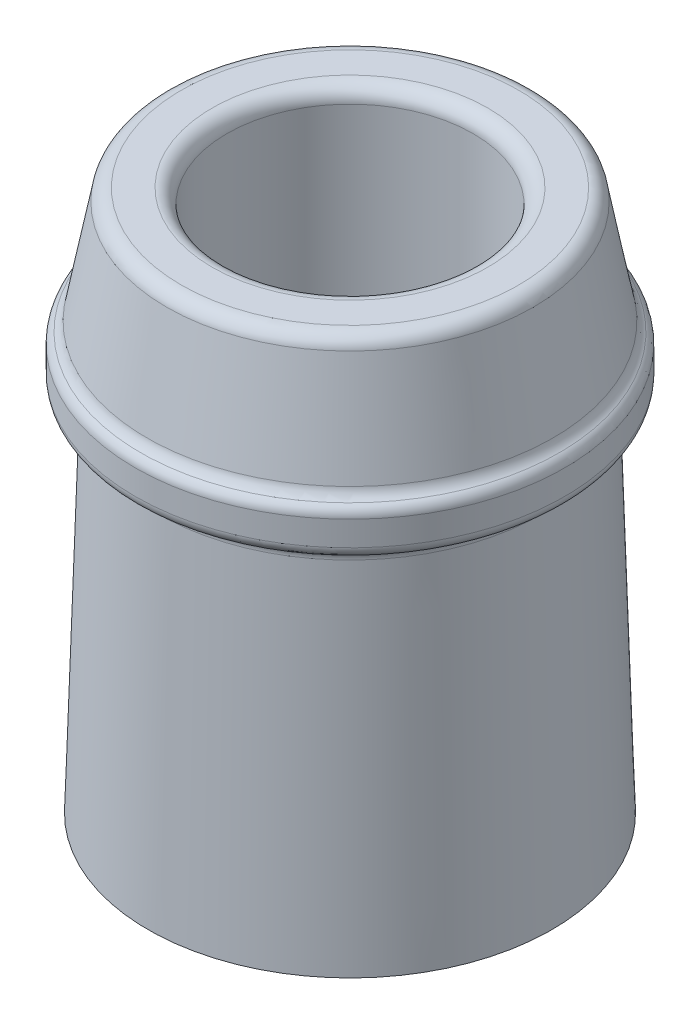
ISO-10303-21;
HEADER;
FILE_DESCRIPTION(('STEP AP214'),'2;1');
FILE_NAME('part.step','',(''),(''),'','','');
FILE_SCHEMA(('AUTOMOTIVE_DESIGN { 1 0 10303 214 1 1 1 1 }'));
ENDSEC;
DATA;
#1=APPLICATION_CONTEXT('core data for automotive mechanical design processes');
#2=APPLICATION_PROTOCOL_DEFINITION('international standard','automotive_design',2000,#1);
#3=PRODUCT_CONTEXT('',#1,'mechanical');
#4=PRODUCT('Part','Part','',(#3));
#5=PRODUCT_RELATED_PRODUCT_CATEGORY('part','',(#4));
#6=PRODUCT_DEFINITION_FORMATION('','',#4);
#7=PRODUCT_DEFINITION_CONTEXT('part definition',#1,'design');
#8=PRODUCT_DEFINITION('design','',#6,#7);
#9=PRODUCT_DEFINITION_SHAPE('','',#8);
#10=(LENGTH_UNIT() NAMED_UNIT(*) SI_UNIT(.MILLI.,.METRE.));
#11=(NAMED_UNIT(*) PLANE_ANGLE_UNIT() SI_UNIT($,.RADIAN.));
#12=(NAMED_UNIT(*) SI_UNIT($,.STERADIAN.) SOLID_ANGLE_UNIT());
#13=UNCERTAINTY_MEASURE_WITH_UNIT(LENGTH_MEASURE(1.E-05),#10,'distance_accuracy_value','');
#14=(GEOMETRIC_REPRESENTATION_CONTEXT(3) GLOBAL_UNCERTAINTY_ASSIGNED_CONTEXT((#13)) GLOBAL_UNIT_ASSIGNED_CONTEXT((#10,
#11,#12)) REPRESENTATION_CONTEXT('',''));
#15=CARTESIAN_POINT('',(0.,0.,0.));
#16=DIRECTION('',(0.,0.,1.));
#17=DIRECTION('',(1.,0.,0.));
#18=AXIS2_PLACEMENT_3D('',#15,#16,#17);
#19=CARTESIAN_POINT('',(7.35,22.,0.));
#20=DIRECTION('',(0.,1.,0.));
#21=DIRECTION('',(0.,0.,1.));
#22=AXIS2_PLACEMENT_3D('',#19,#20,#21);
#23=PLANE('',#22);
#24=CARTESIAN_POINT('',(0.,22.,0.));
#25=DIRECTION('',(0.,1.,0.));
#26=DIRECTION('',(0.,0.,1.));
#27=AXIS2_PLACEMENT_3D('',#24,#25,#26);
#28=CIRCLE('',#27,5.6);
#29=CARTESIAN_POINT('',(0.,22.,5.6));
#30=VERTEX_POINT('',#29);
#31=EDGE_CURVE('E58',#30,#30,#28,.F.);
#32=ORIENTED_EDGE('',*,*,#31,.T.);
#33=EDGE_LOOP('',(#32));
#34=FACE_BOUND('',#33,.T.);
#35=CARTESIAN_POINT('',(0.,22.,0.));
#36=DIRECTION('',(0.,1.,0.));
#37=DIRECTION('',(0.,0.,1.));
#38=AXIS2_PLACEMENT_3D('',#35,#36,#37);
#39=CIRCLE('',#38,6.85326601535529);
#40=CARTESIAN_POINT('',(0.,22.,6.85326601535529));
#41=VERTEX_POINT('',#40);
#42=EDGE_CURVE('E61',#41,#41,#39,.T.);
#43=ORIENTED_EDGE('',*,*,#42,.T.);
#44=EDGE_LOOP('',(#43));
#45=FACE_BOUND('',#44,.T.);
#46=ADVANCED_FACE('F32',(#34,#45),#23,.T.);
#47=CARTESIAN_POINT('',(0.,0.,0.));
#48=DIRECTION('',(0.,-1.,0.));
#49=DIRECTION('',(0.,0.,-1.));
#50=AXIS2_PLACEMENT_3D('',#47,#48,#49);
#51=CYLINDRICAL_SURFACE('',#50,5.);
#52=CARTESIAN_POINT('',(0.,21.4,0.));
#53=DIRECTION('',(0.,1.,0.));
#54=DIRECTION('',(0.,0.,1.));
#55=AXIS2_PLACEMENT_3D('',#52,#53,#54);
#56=CIRCLE('',#55,5.);
#57=CARTESIAN_POINT('',(0.,21.4,5.));
#58=VERTEX_POINT('',#57);
#59=EDGE_CURVE('E55',#58,#58,#56,.T.);
#60=ORIENTED_EDGE('',*,*,#59,.T.);
#61=EDGE_LOOP('',(#60));
#62=FACE_BOUND('',#61,.T.);
#63=CARTESIAN_POINT('',(0.,0.,0.));
#64=DIRECTION('',(0.,-1.,0.));
#65=DIRECTION('',(0.,0.,-1.));
#66=AXIS2_PLACEMENT_3D('',#63,#64,#65);
#67=CIRCLE('',#66,5.);
#68=CARTESIAN_POINT('',(0.,0.,-5.));
#69=VERTEX_POINT('',#68);
#70=EDGE_CURVE('E70',#69,#69,#67,.T.);
#71=ORIENTED_EDGE('',*,*,#70,.T.);
#72=EDGE_LOOP('',(#71));
#73=FACE_BOUND('',#72,.T.);
#74=ADVANCED_FACE('F92',(#62,#73),#51,.F.);
#75=CARTESIAN_POINT('',(8.2,0.,0.));
#76=DIRECTION('',(0.,-1.,0.));
#77=DIRECTION('',(0.,0.,-1.));
#78=AXIS2_PLACEMENT_3D('',#75,#76,#77);
#79=PLANE('',#78);
#80=CARTESIAN_POINT('',(0.,0.,0.));
#81=DIRECTION('',(0.,-1.,0.));
#82=DIRECTION('',(0.,0.,-1.));
#83=AXIS2_PLACEMENT_3D('',#80,#81,#82);
#84=CIRCLE('',#83,8.2);
#85=CARTESIAN_POINT('',(0.,0.,-8.2));
#86=VERTEX_POINT('',#85);
#87=EDGE_CURVE('E73',#86,#86,#84,.T.);
#88=ORIENTED_EDGE('',*,*,#87,.T.);
#89=EDGE_LOOP('',(#88));
#90=FACE_BOUND('',#89,.T.);
#91=ORIENTED_EDGE('',*,*,#70,.F.);
#92=EDGE_LOOP('',(#91));
#93=FACE_BOUND('',#92,.T.);
#94=ADVANCED_FACE('F77',(#90,#93),#79,.T.);
#95=CARTESIAN_POINT('',(0.,0.,0.));
#96=DIRECTION('',(0.,-1.,0.));
#97=DIRECTION('',(0.,0.,-1.));
#98=AXIS2_PLACEMENT_3D('',#95,#96,#97);
#99=CONICAL_SURFACE('',#98,8.2,0.0299910048568778);
#100=CARTESIAN_POINT('',(0.,14.39134138244,0.));
#101=DIRECTION('',(0.,-1.,0.));
#102=DIRECTION('',(0.,0.,-1.));
#103=AXIS2_PLACEMENT_3D('',#100,#101,#102);
#104=CIRCLE('',#103,7.7682597585268);
#105=CARTESIAN_POINT('',(0.,14.39134138244,-7.7682597585268));
#106=VERTEX_POINT('',#105);
#107=EDGE_CURVE('E43',#106,#106,#104,.T.);
#108=ORIENTED_EDGE('',*,*,#107,.T.);
#109=EDGE_LOOP('',(#108));
#110=FACE_BOUND('',#109,.T.);
#111=ORIENTED_EDGE('',*,*,#87,.F.);
#112=EDGE_LOOP('',(#111));
#113=FACE_BOUND('',#112,.T.);
#114=ADVANCED_FACE('F80',(#110,#113),#99,.T.);
#115=CARTESIAN_POINT('',(0.,0.,0.));
#116=DIRECTION('',(0.,-1.,0.));
#117=DIRECTION('',(0.,0.,-1.));
#118=AXIS2_PLACEMENT_3D('',#115,#116,#117);
#119=CYLINDRICAL_SURFACE('',#118,8.725);
#120=CARTESIAN_POINT('',(0.,15.5,0.));
#121=DIRECTION('',(0.,-1.,0.));
#122=DIRECTION('',(0.,0.,-1.));
#123=AXIS2_PLACEMENT_3D('',#120,#121,#122);
#124=CIRCLE('',#123,8.725);
#125=CARTESIAN_POINT('',(0.,15.5,-8.725));
#126=VERTEX_POINT('',#125);
#127=EDGE_CURVE('E64',#126,#126,#124,.F.);
#128=ORIENTED_EDGE('',*,*,#127,.T.);
#129=EDGE_LOOP('',(#128));
#130=FACE_BOUND('',#129,.T.);
#131=CARTESIAN_POINT('',(0.,16.5056570016679,0.));
#132=DIRECTION('',(0.,1.,0.));
#133=DIRECTION('',(0.,0.,1.));
#134=AXIS2_PLACEMENT_3D('',#131,#132,#133);
#135=CIRCLE('',#134,8.725);
#136=CARTESIAN_POINT('',(0.,16.5056570016679,8.725));
#137=VERTEX_POINT('',#136);
#138=EDGE_CURVE('E67',#137,#137,#135,.F.);
#139=ORIENTED_EDGE('',*,*,#138,.T.);
#140=EDGE_LOOP('',(#139));
#141=FACE_BOUND('',#140,.T.);
#142=ADVANCED_FACE('F82',(#130,#141),#119,.T.);
#143=CARTESIAN_POINT('',(0.,17.,0.));
#144=DIRECTION('',(0.,-1.,0.));
#145=DIRECTION('',(0.,0.,-1.));
#146=AXIS2_PLACEMENT_3D('',#143,#144,#145);
#147=CONICAL_SURFACE('',#146,8.3,0.187761946513593);
#148=CARTESIAN_POINT('',(0.,21.511996387494,0.));
#149=DIRECTION('',(0.,1.,0.));
#150=DIRECTION('',(0.,0.,1.));
#151=AXIS2_PLACEMENT_3D('',#148,#149,#150);
#152=CIRCLE('',#151,7.44272068637615);
#153=CARTESIAN_POINT('',(0.,21.511996387494,7.44272068637615));
#154=VERTEX_POINT('',#153);
#155=EDGE_CURVE('E47',#154,#154,#152,.F.);
#156=ORIENTED_EDGE('',*,*,#155,.T.);
#157=EDGE_LOOP('',(#156));
#158=FACE_BOUND('',#157,.T.);
#159=CARTESIAN_POINT('',(0.,17.3122591132258,0.));
#160=DIRECTION('',(0.,-1.,0.));
#161=DIRECTION('',(0.,0.,-1.));
#162=AXIS2_PLACEMENT_3D('',#159,#160,#161);
#163=CIRCLE('',#162,8.24067076848711);
#164=CARTESIAN_POINT('',(0.,17.3122591132258,-8.24067076848711));
#165=VERTEX_POINT('',#164);
#166=EDGE_CURVE('E52',#165,#165,#163,.F.);
#167=ORIENTED_EDGE('',*,*,#166,.T.);
#168=EDGE_LOOP('',(#167));
#169=FACE_BOUND('',#168,.T.);
#170=ADVANCED_FACE('F89',(#158,#169),#147,.T.);
#171=CARTESIAN_POINT('',(0.,15.5,0.));
#172=DIRECTION('',(0.,-1.,0.));
#173=DIRECTION('',(0.,0.,-1.));
#174=AXIS2_PLACEMENT_3D('',#171,#172,#173);
#175=TOROIDAL_SURFACE('',#174,8.225,0.5);
#176=CARTESIAN_POINT('',(0.,15.0042424035935,0.));
#177=DIRECTION('',(0.,1.,0.));
#178=DIRECTION('',(0.,0.,1.));
#179=AXIS2_PLACEMENT_3D('',#176,#177,#178);
#180=CIRCLE('',#179,8.28999542756359);
#181=CARTESIAN_POINT('',(0.,15.0042424035935,8.28999542756359));
#182=VERTEX_POINT('',#181);
#183=EDGE_CURVE('E39',#182,#182,#180,.T.);
#184=ORIENTED_EDGE('',*,*,#183,.T.);
#185=EDGE_LOOP('',(#184));
#186=FACE_BOUND('',#185,.T.);
#187=ORIENTED_EDGE('',*,*,#127,.F.);
#188=EDGE_LOOP('',(#187));
#189=FACE_BOUND('',#188,.T.);
#190=ADVANCED_FACE('F104',(#186,#189),#175,.T.);
#191=CARTESIAN_POINT('',(0.,16.5056570016679,0.));
#192=DIRECTION('',(0.,1.,0.));
#193=DIRECTION('',(0.,0.,1.));
#194=AXIS2_PLACEMENT_3D('',#191,#192,#193);
#195=TOROIDAL_SURFACE('',#194,8.225,0.5);
#196=CARTESIAN_POINT('',(0.,16.9232017739642,0.));
#197=DIRECTION('',(0.,-1.,0.));
#198=DIRECTION('',(0.,0.,-1.));
#199=AXIS2_PLACEMENT_3D('',#196,#197,#198);
#200=CIRCLE('',#199,8.50005701795821);
#201=CARTESIAN_POINT('',(0.,16.9232017739642,-8.50005701795821));
#202=VERTEX_POINT('',#201);
#203=EDGE_CURVE('E10',#202,#202,#200,.T.);
#204=ORIENTED_EDGE('',*,*,#203,.T.);
#205=EDGE_LOOP('',(#204));
#206=FACE_BOUND('',#205,.T.);
#207=ORIENTED_EDGE('',*,*,#138,.F.);
#208=EDGE_LOOP('',(#207));
#209=FACE_BOUND('',#208,.T.);
#210=ADVANCED_FACE('F107',(#206,#209),#195,.T.);
#211=CARTESIAN_POINT('',(0.,21.4,0.));
#212=DIRECTION('',(0.,1.,0.));
#213=DIRECTION('',(0.,0.,1.));
#214=AXIS2_PLACEMENT_3D('',#211,#212,#213);
#215=TOROIDAL_SURFACE('',#214,5.6,0.6);
#216=ORIENTED_EDGE('',*,*,#59,.F.);
#217=EDGE_LOOP('',(#216));
#218=FACE_BOUND('',#217,.T.);
#219=ORIENTED_EDGE('',*,*,#31,.F.);
#220=EDGE_LOOP('',(#219));
#221=FACE_BOUND('',#220,.T.);
#222=ADVANCED_FACE('F110',(#218,#221),#215,.T.);
#223=CARTESIAN_POINT('',(0.,21.4,0.));
#224=DIRECTION('',(0.,1.,0.));
#225=DIRECTION('',(0.,0.,1.));
#226=AXIS2_PLACEMENT_3D('',#223,#224,#225);
#227=TOROIDAL_SURFACE('',#226,6.85326601535529,0.6);
#228=ORIENTED_EDGE('',*,*,#42,.F.);
#229=EDGE_LOOP('',(#228));
#230=FACE_BOUND('',#229,.T.);
#231=ORIENTED_EDGE('',*,*,#155,.F.);
#232=EDGE_LOOP('',(#231));
#233=FACE_BOUND('',#232,.T.);
#234=ADVANCED_FACE('F113',(#230,#233),#227,.T.);
#235=CARTESIAN_POINT('',(0.,14.4093332879034,0.));
#236=DIRECTION('',(0.,-1.,0.));
#237=DIRECTION('',(0.,0.,-1.));
#238=AXIS2_PLACEMENT_3D('',#235,#236,#237);
#239=TOROIDAL_SURFACE('',#238,8.36798994064022,0.6);
#240=ORIENTED_EDGE('',*,*,#183,.F.);
#241=EDGE_LOOP('',(#240));
#242=FACE_BOUND('',#241,.T.);
#243=ORIENTED_EDGE('',*,*,#107,.F.);
#244=EDGE_LOOP('',(#243));
#245=FACE_BOUND('',#244,.T.);
#246=ADVANCED_FACE('F116',(#242,#245),#239,.F.);
#247=CARTESIAN_POINT('',(0.,17.4242555007197,0.));
#248=DIRECTION('',(0.,-1.,0.));
#249=DIRECTION('',(0.,0.,-1.));
#250=AXIS2_PLACEMENT_3D('',#247,#248,#249);
#251=TOROIDAL_SURFACE('',#250,8.83012543950796,0.6);
#252=ORIENTED_EDGE('',*,*,#166,.F.);
#253=EDGE_LOOP('',(#252));
#254=FACE_BOUND('',#253,.T.);
#255=ORIENTED_EDGE('',*,*,#203,.F.);
#256=EDGE_LOOP('',(#255));
#257=FACE_BOUND('',#256,.T.);
#258=ADVANCED_FACE('F34',(#254,#257),#251,.F.);
#259=CLOSED_SHELL('',(#46,#74,#94,#114,#142,#170,#190,#210,#222,#234,#246,#258));
#260=MANIFOLD_SOLID_BREP('B2',#259);
#261=ADVANCED_BREP_SHAPE_REPRESENTATION('',(#18,#260),#14);
#262=SHAPE_DEFINITION_REPRESENTATION(#9,#261);
ENDSEC;
END-ISO-10303-21;
